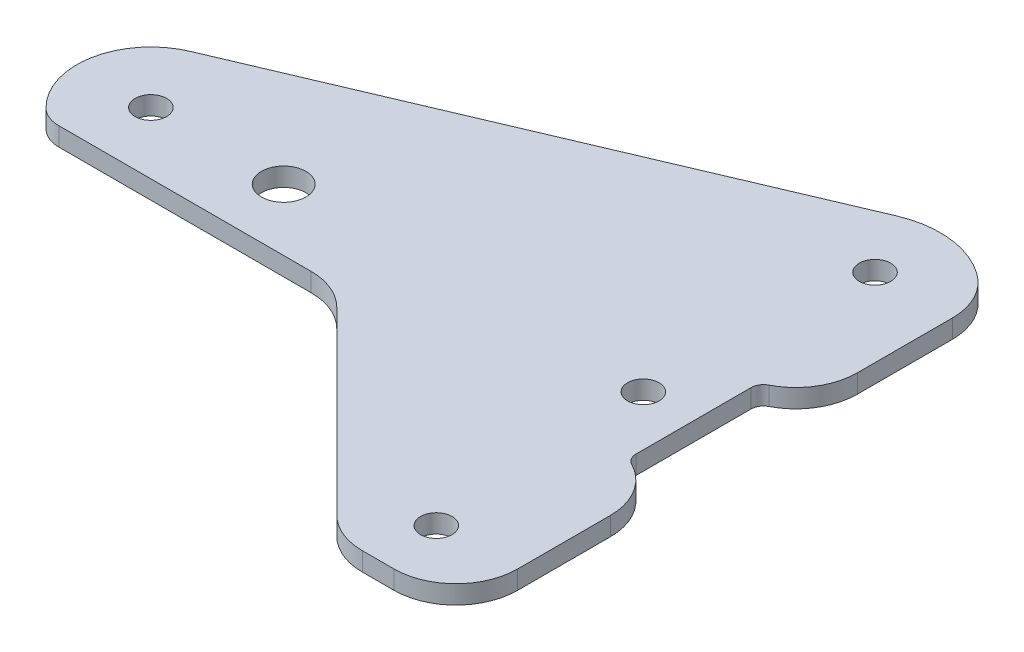
ISO-10303-21;
HEADER;
FILE_DESCRIPTION(('STEP AP214'),'2;1');
FILE_NAME('part.step','',(''),(''),'','','');
FILE_SCHEMA(('AUTOMOTIVE_DESIGN { 1 0 10303 214 1 1 1 1 }'));
ENDSEC;
DATA;
#1=APPLICATION_CONTEXT('core data for automotive mechanical design processes');
#2=APPLICATION_PROTOCOL_DEFINITION('international standard','automotive_design',2000,#1);
#3=PRODUCT_CONTEXT('',#1,'mechanical');
#4=PRODUCT('Part','Part','',(#3));
#5=PRODUCT_RELATED_PRODUCT_CATEGORY('part','',(#4));
#6=PRODUCT_DEFINITION_FORMATION('','',#4);
#7=PRODUCT_DEFINITION_CONTEXT('part definition',#1,'design');
#8=PRODUCT_DEFINITION('design','',#6,#7);
#9=PRODUCT_DEFINITION_SHAPE('','',#8);
#10=(LENGTH_UNIT() NAMED_UNIT(*) SI_UNIT(.MILLI.,.METRE.));
#11=(NAMED_UNIT(*) PLANE_ANGLE_UNIT() SI_UNIT($,.RADIAN.));
#12=(NAMED_UNIT(*) SI_UNIT($,.STERADIAN.) SOLID_ANGLE_UNIT());
#13=UNCERTAINTY_MEASURE_WITH_UNIT(LENGTH_MEASURE(1.E-05),#10,'distance_accuracy_value','');
#14=(GEOMETRIC_REPRESENTATION_CONTEXT(3) GLOBAL_UNCERTAINTY_ASSIGNED_CONTEXT((#13)) GLOBAL_UNIT_ASSIGNED_CONTEXT((#10,
#11,#12)) REPRESENTATION_CONTEXT('',''));
#15=CARTESIAN_POINT('',(0.,0.,0.));
#16=DIRECTION('',(0.,0.,1.));
#17=DIRECTION('',(1.,0.,0.));
#18=AXIS2_PLACEMENT_3D('',#15,#16,#17);
#19=CARTESIAN_POINT('',(164.3506005389,70.6652182043,66.8770558715721));
#20=DIRECTION('',(0.,-1.,0.));
#21=DIRECTION('',(0.,0.,-1.));
#22=AXIS2_PLACEMENT_3D('',#19,#20,#21);
#23=CYLINDRICAL_SURFACE('',#22,9.99999999999454);
#24=CARTESIAN_POINT('',(164.3506005389,67.6652182043,66.8770558715721));
#25=DIRECTION('',(0.,1.,0.));
#26=DIRECTION('',(0.,0.,1.));
#27=AXIS2_PLACEMENT_3D('',#24,#25,#26);
#28=CIRCLE('',#27,9.99999999999454);
#29=CARTESIAN_POINT('',(171.421668350762,67.6652182043,59.8059880597105));
#30=VERTEX_POINT('',#29);
#31=CARTESIAN_POINT('',(164.3506005389,67.6652182043,56.8770558715776));
#32=VERTEX_POINT('',#31);
#33=EDGE_CURVE('E200',#30,#32,#28,.T.);
#34=ORIENTED_EDGE('',*,*,#33,.F.);
#35=DIRECTION('',(0.,-1.,0.));
#36=VECTOR('',#35,1.);
#37=CARTESIAN_POINT('',(171.421668350762,70.6652182043,59.8059880597105));
#38=LINE('',#37,#36);
#39=CARTESIAN_POINT('',(171.421668350762,70.6652182043,59.8059880597105));
#40=VERTEX_POINT('',#39);
#41=EDGE_CURVE('E11',#40,#30,#38,.T.);
#42=ORIENTED_EDGE('',*,*,#41,.F.);
#43=CARTESIAN_POINT('',(164.3506005389,70.6652182043,66.8770558715721));
#44=DIRECTION('',(0.,1.,0.));
#45=DIRECTION('',(0.,0.,1.));
#46=AXIS2_PLACEMENT_3D('',#43,#44,#45);
#47=CIRCLE('',#46,9.99999999999454);
#48=CARTESIAN_POINT('',(164.3506005389,70.6652182043,56.8770558715776));
#49=VERTEX_POINT('',#48);
#50=EDGE_CURVE('E254',#40,#49,#47,.T.);
#51=ORIENTED_EDGE('',*,*,#50,.T.);
#52=DIRECTION('',(0.,-1.,0.));
#53=VECTOR('',#52,1.);
#54=CARTESIAN_POINT('',(164.3506005389,70.6652182043,56.8770558715776));
#55=LINE('',#54,#53);
#56=EDGE_CURVE('E40',#49,#32,#55,.T.);
#57=ORIENTED_EDGE('',*,*,#56,.T.);
#58=EDGE_LOOP('',(#34,#42,#51,#57));
#59=FACE_BOUND('',#58,.T.);
#60=ADVANCED_FACE('F37',(#59),#23,.F.);
#61=CARTESIAN_POINT('',(200.563803974512,70.6652182043,88.9481236834605));
#62=DIRECTION('',(-0.707106781186548,0.,0.707106781186547));
#63=DIRECTION('',(0.707106781186547,0.,0.707106781186548));
#64=AXIS2_PLACEMENT_3D('',#61,#62,#63);
#65=PLANE('',#64);
#66=DIRECTION('',(-0.707106781186547,0.,-0.707106781186548));
#67=VECTOR('',#66,1.);
#68=CARTESIAN_POINT('',(200.563803974512,67.6652182043,88.9481236834605));
#69=LINE('',#68,#67);
#70=CARTESIAN_POINT('',(200.563803974512,67.6652182043,88.9481236834605));
#71=VERTEX_POINT('',#70);
#72=EDGE_CURVE('E252',#71,#30,#69,.T.);
#73=ORIENTED_EDGE('',*,*,#72,.F.);
#74=DIRECTION('',(0.,-1.,0.));
#75=VECTOR('',#74,1.);
#76=CARTESIAN_POINT('',(200.563803974512,70.6652182043,88.9481236834605));
#77=LINE('',#76,#75);
#78=CARTESIAN_POINT('',(200.563803974512,70.6652182043,88.9481236834605));
#79=VERTEX_POINT('',#78);
#80=EDGE_CURVE('E46',#79,#71,#77,.T.);
#81=ORIENTED_EDGE('',*,*,#80,.F.);
#82=DIRECTION('',(-0.707106781186547,0.,-0.707106781186548));
#83=VECTOR('',#82,1.);
#84=CARTESIAN_POINT('',(200.563803974512,70.6652182043,88.9481236834605));
#85=LINE('',#84,#83);
#86=EDGE_CURVE('E190',#79,#40,#85,.T.);
#87=ORIENTED_EDGE('',*,*,#86,.T.);
#88=ORIENTED_EDGE('',*,*,#41,.T.);
#89=EDGE_LOOP('',(#73,#81,#87,#88));
#90=FACE_BOUND('',#89,.T.);
#91=ADVANCED_FACE('F288',(#90),#65,.T.);
#92=CARTESIAN_POINT('',(207.634871786394,70.6652182043,81.8770558715778));
#93=DIRECTION('',(0.,-1.,0.));
#94=DIRECTION('',(0.,0.,-1.));
#95=AXIS2_PLACEMENT_3D('',#92,#93,#94);
#96=CYLINDRICAL_SURFACE('',#95,10.0000000000244);
#97=CARTESIAN_POINT('',(207.634871786394,67.6652182043,81.8770558715778));
#98=DIRECTION('',(0.,-1.,0.));
#99=DIRECTION('',(0.,0.,-1.));
#100=AXIS2_PLACEMENT_3D('',#97,#98,#99);
#101=CIRCLE('',#100,10.0000000000244);
#102=CARTESIAN_POINT('',(207.634871786394,67.6652182043,91.8770558716022));
#103=VERTEX_POINT('',#102);
#104=EDGE_CURVE('E177',#103,#71,#101,.T.);
#105=ORIENTED_EDGE('',*,*,#104,.F.);
#106=DIRECTION('',(0.,-1.,0.));
#107=VECTOR('',#106,1.);
#108=CARTESIAN_POINT('',(207.634871786394,70.6652182043,91.8770558716022));
#109=LINE('',#108,#107);
#110=CARTESIAN_POINT('',(207.634871786394,70.6652182043,91.8770558716022));
#111=VERTEX_POINT('',#110);
#112=EDGE_CURVE('E172',#111,#103,#109,.T.);
#113=ORIENTED_EDGE('',*,*,#112,.F.);
#114=CARTESIAN_POINT('',(207.634871786394,70.6652182043,81.8770558715778));
#115=DIRECTION('',(0.,-1.,0.));
#116=DIRECTION('',(0.,0.,-1.));
#117=AXIS2_PLACEMENT_3D('',#114,#115,#116);
#118=CIRCLE('',#117,10.0000000000244);
#119=EDGE_CURVE('E175',#111,#79,#118,.T.);
#120=ORIENTED_EDGE('',*,*,#119,.T.);
#121=ORIENTED_EDGE('',*,*,#80,.T.);
#122=EDGE_LOOP('',(#105,#113,#120,#121));
#123=FACE_BOUND('',#122,.T.);
#124=ADVANCED_FACE('F174',(#123),#96,.T.);
#125=CARTESIAN_POINT('',(212.764194447496,70.6652182043,91.8770558716022));
#126=DIRECTION('',(0.,0.,1.));
#127=DIRECTION('',(1.,0.,0.));
#128=AXIS2_PLACEMENT_3D('',#125,#126,#127);
#129=PLANE('',#128);
#130=DIRECTION('',(-1.,0.,0.));
#131=VECTOR('',#130,1.);
#132=CARTESIAN_POINT('',(212.764194447496,67.6652182043,91.8770558716022));
#133=LINE('',#132,#131);
#134=CARTESIAN_POINT('',(212.764194447496,67.6652182043,91.8770558716022));
#135=VERTEX_POINT('',#134);
#136=EDGE_CURVE('E249',#135,#103,#133,.T.);
#137=ORIENTED_EDGE('',*,*,#136,.F.);
#138=DIRECTION('',(0.,-1.,0.));
#139=VECTOR('',#138,1.);
#140=CARTESIAN_POINT('',(212.764194447496,70.6652182043,91.8770558716022));
#141=LINE('',#140,#139);
#142=CARTESIAN_POINT('',(212.764194447496,70.6652182043,91.8770558716022));
#143=VERTEX_POINT('',#142);
#144=EDGE_CURVE('E182',#143,#135,#141,.T.);
#145=ORIENTED_EDGE('',*,*,#144,.F.);
#146=DIRECTION('',(-1.,0.,0.));
#147=VECTOR('',#146,1.);
#148=CARTESIAN_POINT('',(212.764194447496,70.6652182043,91.8770558716022));
#149=LINE('',#148,#147);
#150=EDGE_CURVE('E188',#143,#111,#149,.T.);
#151=ORIENTED_EDGE('',*,*,#150,.T.);
#152=ORIENTED_EDGE('',*,*,#112,.T.);
#153=EDGE_LOOP('',(#137,#145,#151,#152));
#154=FACE_BOUND('',#153,.T.);
#155=ADVANCED_FACE('F192',(#154),#129,.T.);
#156=CARTESIAN_POINT('',(212.764194447496,70.6652182043,81.8770558716022));
#157=DIRECTION('',(0.,-1.,0.));
#158=DIRECTION('',(0.,0.,-1.));
#159=AXIS2_PLACEMENT_3D('',#156,#157,#158);
#160=CYLINDRICAL_SURFACE('',#159,9.99999999999999);
#161=CARTESIAN_POINT('',(212.764194447496,67.6652182043,81.8770558716022));
#162=DIRECTION('',(0.,-1.,0.));
#163=DIRECTION('',(0.,0.,-1.));
#164=AXIS2_PLACEMENT_3D('',#161,#162,#163);
#165=CIRCLE('',#164,9.99999999999999);
#166=CARTESIAN_POINT('',(222.764194447496,67.6652182043,81.8770558716022));
#167=VERTEX_POINT('',#166);
#168=EDGE_CURVE('E246',#167,#135,#165,.T.);
#169=ORIENTED_EDGE('',*,*,#168,.F.);
#170=DIRECTION('',(0.,-1.,0.));
#171=VECTOR('',#170,1.);
#172=CARTESIAN_POINT('',(222.764194447496,70.6652182043,81.8770558716022));
#173=LINE('',#172,#171);
#174=CARTESIAN_POINT('',(222.764194447496,70.6652182043,81.8770558716022));
#175=VERTEX_POINT('',#174);
#176=EDGE_CURVE('E258',#175,#167,#173,.T.);
#177=ORIENTED_EDGE('',*,*,#176,.F.);
#178=CARTESIAN_POINT('',(212.764194447496,70.6652182043,81.8770558716022));
#179=DIRECTION('',(0.,-1.,0.));
#180=DIRECTION('',(0.,0.,-1.));
#181=AXIS2_PLACEMENT_3D('',#178,#179,#180);
#182=CIRCLE('',#181,9.99999999999999);
#183=EDGE_CURVE('E193',#175,#143,#182,.T.);
#184=ORIENTED_EDGE('',*,*,#183,.T.);
#185=ORIENTED_EDGE('',*,*,#144,.T.);
#186=EDGE_LOOP('',(#169,#177,#184,#185));
#187=FACE_BOUND('',#186,.T.);
#188=ADVANCED_FACE('F301',(#187),#160,.T.);
#189=CARTESIAN_POINT('',(222.764194447496,70.6652182043,66.8770558715946));
#190=DIRECTION('',(1.,0.,0.));
#191=DIRECTION('',(0.,0.,-1.));
#192=AXIS2_PLACEMENT_3D('',#189,#190,#191);
#193=PLANE('',#192);
#194=DIRECTION('',(0.,0.,1.));
#195=VECTOR('',#194,1.);
#196=CARTESIAN_POINT('',(222.764194447496,67.6652182043,66.8770558715946));
#197=LINE('',#196,#195);
#198=CARTESIAN_POINT('',(222.764194447496,67.6652182043,66.8770558715946));
#199=VERTEX_POINT('',#198);
#200=EDGE_CURVE('E243',#199,#167,#197,.T.);
#201=ORIENTED_EDGE('',*,*,#200,.F.);
#202=DIRECTION('',(0.,-1.,0.));
#203=VECTOR('',#202,1.);
#204=CARTESIAN_POINT('',(222.764194447496,70.6652182043,66.8770558715946));
#205=LINE('',#204,#203);
#206=CARTESIAN_POINT('',(222.764194447496,70.6652182043,66.8770558715946));
#207=VERTEX_POINT('',#206);
#208=EDGE_CURVE('E260',#207,#199,#205,.T.);
#209=ORIENTED_EDGE('',*,*,#208,.F.);
#210=DIRECTION('',(0.,0.,1.));
#211=VECTOR('',#210,1.);
#212=CARTESIAN_POINT('',(222.764194447496,70.6652182043,66.8770558715946));
#213=LINE('',#212,#211);
#214=EDGE_CURVE('E195',#207,#175,#213,.T.);
#215=ORIENTED_EDGE('',*,*,#214,.T.);
#216=ORIENTED_EDGE('',*,*,#176,.T.);
#217=EDGE_LOOP('',(#201,#209,#215,#216));
#218=FACE_BOUND('',#217,.T.);
#219=ADVANCED_FACE('F304',(#218),#193,.T.);
#220=CARTESIAN_POINT('',(212.764194447496,70.6652182043,66.8770558715946));
#221=DIRECTION('',(0.,-1.,0.));
#222=DIRECTION('',(0.,0.,-1.));
#223=AXIS2_PLACEMENT_3D('',#220,#221,#222);
#224=CYLINDRICAL_SURFACE('',#223,10.);
#225=CARTESIAN_POINT('',(212.764194447496,67.6652182043,66.8770558715946));
#226=DIRECTION('',(0.,-1.,0.));
#227=DIRECTION('',(0.,0.,-1.));
#228=AXIS2_PLACEMENT_3D('',#225,#226,#227);
#229=CIRCLE('',#228,10.);
#230=CARTESIAN_POINT('',(217.323870368331,67.6652182043,57.9770920797043));
#231=VERTEX_POINT('',#230);
#232=EDGE_CURVE('E240',#231,#199,#229,.T.);
#233=ORIENTED_EDGE('',*,*,#232,.F.);
#234=DIRECTION('',(0.,-1.,0.));
#235=VECTOR('',#234,1.);
#236=CARTESIAN_POINT('',(217.323870368331,70.6652182043,57.9770920797043));
#237=LINE('',#236,#235);
#238=CARTESIAN_POINT('',(217.323870368331,70.6652182043,57.9770920797043));
#239=VERTEX_POINT('',#238);
#240=EDGE_CURVE('E262',#239,#231,#237,.T.);
#241=ORIENTED_EDGE('',*,*,#240,.F.);
#242=CARTESIAN_POINT('',(212.764194447496,70.6652182043,66.8770558715946));
#243=DIRECTION('',(0.,-1.,0.));
#244=DIRECTION('',(0.,0.,-1.));
#245=AXIS2_PLACEMENT_3D('',#242,#243,#244);
#246=CIRCLE('',#245,10.);
#247=EDGE_CURVE('E457',#239,#207,#246,.T.);
#248=ORIENTED_EDGE('',*,*,#247,.T.);
#249=ORIENTED_EDGE('',*,*,#208,.T.);
#250=EDGE_LOOP('',(#233,#241,#248,#249));
#251=FACE_BOUND('',#250,.T.);
#252=ADVANCED_FACE('F308',(#251),#224,.T.);
#253=CARTESIAN_POINT('',(218.235805552496,70.6652182043,56.19709932133));
#254=DIRECTION('',(0.,-1.,0.));
#255=DIRECTION('',(0.,0.,-1.));
#256=AXIS2_PLACEMENT_3D('',#253,#254,#255);
#257=CYLINDRICAL_SURFACE('',#256,1.99999999999585);
#258=CARTESIAN_POINT('',(218.235805552496,67.6652182043,56.19709932133));
#259=DIRECTION('',(0.,1.,0.));
#260=DIRECTION('',(0.,0.,1.));
#261=AXIS2_PLACEMENT_3D('',#258,#259,#260);
#262=CIRCLE('',#261,1.99999999999585);
#263=CARTESIAN_POINT('',(216.2358055525,67.6652182043,56.19709932133));
#264=VERTEX_POINT('',#263);
#265=EDGE_CURVE('E237',#264,#231,#262,.T.);
#266=ORIENTED_EDGE('',*,*,#265,.F.);
#267=DIRECTION('',(0.,-1.,0.));
#268=VECTOR('',#267,1.);
#269=CARTESIAN_POINT('',(216.2358055525,70.6652182043,56.19709932133));
#270=LINE('',#269,#268);
#271=CARTESIAN_POINT('',(216.2358055525,70.6652182043,56.19709932133));
#272=VERTEX_POINT('',#271);
#273=EDGE_CURVE('E264',#272,#264,#270,.T.);
#274=ORIENTED_EDGE('',*,*,#273,.F.);
#275=CARTESIAN_POINT('',(218.235805552496,70.6652182043,56.19709932133));
#276=DIRECTION('',(0.,1.,0.));
#277=DIRECTION('',(0.,0.,1.));
#278=AXIS2_PLACEMENT_3D('',#275,#276,#277);
#279=CIRCLE('',#278,1.99999999999585);
#280=EDGE_CURVE('E454',#272,#239,#279,.T.);
#281=ORIENTED_EDGE('',*,*,#280,.T.);
#282=ORIENTED_EDGE('',*,*,#240,.T.);
#283=EDGE_LOOP('',(#266,#274,#281,#282));
#284=FACE_BOUND('',#283,.T.);
#285=ADVANCED_FACE('F312',(#284),#257,.F.);
#286=CARTESIAN_POINT('',(216.2358055525,70.6652182043,37.55701242185));
#287=DIRECTION('',(1.,0.,0.));
#288=DIRECTION('',(0.,0.,-1.));
#289=AXIS2_PLACEMENT_3D('',#286,#287,#288);
#290=PLANE('',#289);
#291=DIRECTION('',(0.,0.,1.));
#292=VECTOR('',#291,1.);
#293=CARTESIAN_POINT('',(216.2358055525,67.6652182043,37.55701242185));
#294=LINE('',#293,#292);
#295=CARTESIAN_POINT('',(216.2358055525,67.6652182043,37.55701242185));
#296=VERTEX_POINT('',#295);
#297=EDGE_CURVE('E234',#296,#264,#294,.T.);
#298=ORIENTED_EDGE('',*,*,#297,.F.);
#299=DIRECTION('',(0.,-1.,0.));
#300=VECTOR('',#299,1.);
#301=CARTESIAN_POINT('',(216.2358055525,70.6652182043,37.55701242185));
#302=LINE('',#301,#300);
#303=CARTESIAN_POINT('',(216.2358055525,70.6652182043,37.55701242185));
#304=VERTEX_POINT('',#303);
#305=EDGE_CURVE('E266',#304,#296,#302,.T.);
#306=ORIENTED_EDGE('',*,*,#305,.F.);
#307=DIRECTION('',(0.,0.,1.));
#308=VECTOR('',#307,1.);
#309=CARTESIAN_POINT('',(216.2358055525,70.6652182043,37.55701242185));
#310=LINE('',#309,#308);
#311=EDGE_CURVE('E451',#304,#272,#310,.T.);
#312=ORIENTED_EDGE('',*,*,#311,.T.);
#313=ORIENTED_EDGE('',*,*,#273,.T.);
#314=EDGE_LOOP('',(#298,#306,#312,#313));
#315=FACE_BOUND('',#314,.T.);
#316=ADVANCED_FACE('F316',(#315),#290,.T.);
#317=CARTESIAN_POINT('',(218.2358055525,70.6652182043,37.55701242185));
#318=DIRECTION('',(0.,-1.,0.));
#319=DIRECTION('',(0.,0.,-1.));
#320=AXIS2_PLACEMENT_3D('',#317,#318,#319);
#321=CYLINDRICAL_SURFACE('',#320,1.99999999999944);
#322=CARTESIAN_POINT('',(218.2358055525,67.6652182043,37.55701242185));
#323=DIRECTION('',(0.,1.,0.));
#324=DIRECTION('',(0.,0.,1.));
#325=AXIS2_PLACEMENT_3D('',#322,#323,#324);
#326=CIRCLE('',#325,1.99999999999944);
#327=CARTESIAN_POINT('',(217.323870368332,67.6652182043,35.7770196634733));
#328=VERTEX_POINT('',#327);
#329=EDGE_CURVE('E231',#328,#296,#326,.T.);
#330=ORIENTED_EDGE('',*,*,#329,.F.);
#331=DIRECTION('',(0.,-1.,0.));
#332=VECTOR('',#331,1.);
#333=CARTESIAN_POINT('',(217.323870368332,70.6652182043,35.7770196634733));
#334=LINE('',#333,#332);
#335=CARTESIAN_POINT('',(217.323870368332,70.6652182043,35.7770196634733));
#336=VERTEX_POINT('',#335);
#337=EDGE_CURVE('E268',#336,#328,#334,.T.);
#338=ORIENTED_EDGE('',*,*,#337,.F.);
#339=CARTESIAN_POINT('',(218.2358055525,70.6652182043,37.55701242185));
#340=DIRECTION('',(0.,1.,0.));
#341=DIRECTION('',(0.,0.,1.));
#342=AXIS2_PLACEMENT_3D('',#339,#340,#341);
#343=CIRCLE('',#342,1.99999999999944);
#344=EDGE_CURVE('E448',#336,#304,#343,.T.);
#345=ORIENTED_EDGE('',*,*,#344,.T.);
#346=ORIENTED_EDGE('',*,*,#305,.T.);
#347=EDGE_LOOP('',(#330,#338,#345,#346));
#348=FACE_BOUND('',#347,.T.);
#349=ADVANCED_FACE('F320',(#348),#321,.F.);
#350=CARTESIAN_POINT('',(212.764194447498,70.6652182043,26.8770558715855));
#351=DIRECTION('',(0.,-1.,0.));
#352=DIRECTION('',(0.,0.,-1.));
#353=AXIS2_PLACEMENT_3D('',#350,#351,#352);
#354=CYLINDRICAL_SURFACE('',#353,9.99999999999794);
#355=CARTESIAN_POINT('',(212.764194447498,67.6652182043,26.8770558715855));
#356=DIRECTION('',(0.,-1.,0.));
#357=DIRECTION('',(0.,0.,-1.));
#358=AXIS2_PLACEMENT_3D('',#355,#356,#357);
#359=CIRCLE('',#358,9.99999999999794);
#360=CARTESIAN_POINT('',(222.764194447496,67.6652182043,26.8770558715855));
#361=VERTEX_POINT('',#360);
#362=EDGE_CURVE('E228',#361,#328,#359,.T.);
#363=ORIENTED_EDGE('',*,*,#362,.F.);
#364=DIRECTION('',(0.,-1.,0.));
#365=VECTOR('',#364,1.);
#366=CARTESIAN_POINT('',(222.764194447496,70.6652182043,26.8770558715855));
#367=LINE('',#366,#365);
#368=CARTESIAN_POINT('',(222.764194447496,70.6652182043,26.8770558715855));
#369=VERTEX_POINT('',#368);
#370=EDGE_CURVE('E270',#369,#361,#367,.T.);
#371=ORIENTED_EDGE('',*,*,#370,.F.);
#372=CARTESIAN_POINT('',(212.764194447498,70.6652182043,26.8770558715855));
#373=DIRECTION('',(0.,-1.,0.));
#374=DIRECTION('',(0.,0.,-1.));
#375=AXIS2_PLACEMENT_3D('',#372,#373,#374);
#376=CIRCLE('',#375,9.99999999999794);
#377=EDGE_CURVE('E445',#369,#336,#376,.T.);
#378=ORIENTED_EDGE('',*,*,#377,.T.);
#379=ORIENTED_EDGE('',*,*,#337,.T.);
#380=EDGE_LOOP('',(#363,#371,#378,#379));
#381=FACE_BOUND('',#380,.T.);
#382=ADVANCED_FACE('F324',(#381),#354,.T.);
#383=CARTESIAN_POINT('',(222.764194447496,70.6652182043,11.4982039615155));
#384=DIRECTION('',(1.,0.,0.));
#385=DIRECTION('',(0.,0.,-1.));
#386=AXIS2_PLACEMENT_3D('',#383,#384,#385);
#387=PLANE('',#386);
#388=DIRECTION('',(0.,0.,1.));
#389=VECTOR('',#388,1.);
#390=CARTESIAN_POINT('',(222.764194447496,67.6652182043,11.4982039615155));
#391=LINE('',#390,#389);
#392=CARTESIAN_POINT('',(222.764194447496,67.6652182043,11.4982039615155));
#393=VERTEX_POINT('',#392);
#394=EDGE_CURVE('E225',#393,#361,#391,.T.);
#395=ORIENTED_EDGE('',*,*,#394,.F.);
#396=DIRECTION('',(0.,-1.,0.));
#397=VECTOR('',#396,1.);
#398=CARTESIAN_POINT('',(222.764194447496,70.6652182043,11.4982039615155));
#399=LINE('',#398,#397);
#400=CARTESIAN_POINT('',(222.764194447496,70.6652182043,11.4982039615155));
#401=VERTEX_POINT('',#400);
#402=EDGE_CURVE('E272',#401,#393,#399,.T.);
#403=ORIENTED_EDGE('',*,*,#402,.F.);
#404=DIRECTION('',(0.,0.,1.));
#405=VECTOR('',#404,1.);
#406=CARTESIAN_POINT('',(222.764194447496,70.6652182043,11.4982039615155));
#407=LINE('',#406,#405);
#408=EDGE_CURVE('E442',#401,#369,#407,.T.);
#409=ORIENTED_EDGE('',*,*,#408,.T.);
#410=ORIENTED_EDGE('',*,*,#370,.T.);
#411=EDGE_LOOP('',(#395,#403,#409,#410));
#412=FACE_BOUND('',#411,.T.);
#413=ADVANCED_FACE('F328',(#412),#387,.T.);
#414=CARTESIAN_POINT('',(212.764194447498,70.6652182043,11.4982039615155));
#415=DIRECTION('',(0.,-1.,0.));
#416=DIRECTION('',(0.,0.,-1.));
#417=AXIS2_PLACEMENT_3D('',#414,#415,#416);
#418=CYLINDRICAL_SURFACE('',#417,9.99999999999799);
#419=CARTESIAN_POINT('',(212.764194447498,67.6652182043,11.4982039615155));
#420=DIRECTION('',(0.,-1.,0.));
#421=DIRECTION('',(0.,0.,-1.));
#422=AXIS2_PLACEMENT_3D('',#419,#420,#421);
#423=CIRCLE('',#422,9.99999999999799);
#424=CARTESIAN_POINT('',(218.548253692553,67.6652182043,3.34071300843169));
#425=VERTEX_POINT('',#424);
#426=EDGE_CURVE('E222',#425,#393,#423,.T.);
#427=ORIENTED_EDGE('',*,*,#426,.F.);
#428=DIRECTION('',(0.,-1.,0.));
#429=VECTOR('',#428,1.);
#430=CARTESIAN_POINT('',(218.548253692553,70.6652182043,3.34071300843169));
#431=LINE('',#430,#429);
#432=CARTESIAN_POINT('',(218.548253692553,70.6652182043,3.34071300843169));
#433=VERTEX_POINT('',#432);
#434=EDGE_CURVE('E274',#433,#425,#431,.T.);
#435=ORIENTED_EDGE('',*,*,#434,.F.);
#436=CARTESIAN_POINT('',(212.764194447498,70.6652182043,11.4982039615155));
#437=DIRECTION('',(0.,-1.,0.));
#438=DIRECTION('',(0.,0.,-1.));
#439=AXIS2_PLACEMENT_3D('',#436,#437,#438);
#440=CIRCLE('',#439,9.99999999999799);
#441=EDGE_CURVE('E439',#433,#401,#440,.T.);
#442=ORIENTED_EDGE('',*,*,#441,.T.);
#443=ORIENTED_EDGE('',*,*,#402,.T.);
#444=EDGE_LOOP('',(#427,#435,#442,#443));
#445=FACE_BOUND('',#444,.T.);
#446=ADVANCED_FACE('F332',(#445),#418,.T.);
#447=CARTESIAN_POINT('',(218.489516870081,70.6652182043,3.2990657344106));
#448=DIRECTION('',(0.578405924505795,0.,-0.815749095308476));
#449=DIRECTION('',(-0.815749095308476,0.,-0.578405924505795));
#450=AXIS2_PLACEMENT_3D('',#447,#448,#449);
#451=PLANE('',#450);
#452=DIRECTION('',(0.815749095308476,0.,0.578405924505795));
#453=VECTOR('',#452,1.);
#454=CARTESIAN_POINT('',(218.489516870081,67.6652182043,3.2990657344106));
#455=LINE('',#454,#453);
#456=CARTESIAN_POINT('',(218.489516870081,67.6652182043,3.2990657344106));
#457=VERTEX_POINT('',#456);
#458=EDGE_CURVE('E219',#457,#425,#455,.T.);
#459=ORIENTED_EDGE('',*,*,#458,.F.);
#460=DIRECTION('',(0.,-1.,0.));
#461=VECTOR('',#460,1.);
#462=CARTESIAN_POINT('',(218.489516870081,70.6652182043,3.2990657344106));
#463=LINE('',#462,#461);
#464=CARTESIAN_POINT('',(218.489516870081,70.6652182043,3.2990657344106));
#465=VERTEX_POINT('',#464);
#466=EDGE_CURVE('E276',#465,#457,#463,.T.);
#467=ORIENTED_EDGE('',*,*,#466,.F.);
#468=DIRECTION('',(0.815749095308476,0.,0.578405924505795));
#469=VECTOR('',#468,1.);
#470=CARTESIAN_POINT('',(218.489516870081,70.6652182043,3.2990657344106));
#471=LINE('',#470,#469);
#472=EDGE_CURVE('E436',#465,#433,#471,.T.);
#473=ORIENTED_EDGE('',*,*,#472,.T.);
#474=ORIENTED_EDGE('',*,*,#434,.T.);
#475=EDGE_LOOP('',(#459,#467,#473,#474));
#476=FACE_BOUND('',#475,.T.);
#477=ADVANCED_FACE('F336',(#476),#451,.T.);
#478=CARTESIAN_POINT('',(209.813428002494,70.6652182043,15.5353021640408));
#479=DIRECTION('',(0.,-1.,0.));
#480=DIRECTION('',(0.,0.,-1.));
#481=AXIS2_PLACEMENT_3D('',#478,#479,#480);
#482=CYLINDRICAL_SURFACE('',#481,15.0000000000026);
#483=CARTESIAN_POINT('',(209.813428002494,67.6652182043,15.5353021640408));
#484=DIRECTION('',(0.,-1.,0.));
#485=DIRECTION('',(0.,0.,-1.));
#486=AXIS2_PLACEMENT_3D('',#483,#484,#485);
#487=CIRCLE('',#486,15.0000000000026);
#488=CARTESIAN_POINT('',(203.945738541146,67.6652182043,1.73058484041302));
#489=VERTEX_POINT('',#488);
#490=EDGE_CURVE('E216',#489,#457,#487,.T.);
#491=ORIENTED_EDGE('',*,*,#490,.F.);
#492=DIRECTION('',(0.,-1.,0.));
#493=VECTOR('',#492,1.);
#494=CARTESIAN_POINT('',(203.945738541146,70.6652182043,1.73058484041302));
#495=LINE('',#494,#493);
#496=CARTESIAN_POINT('',(203.945738541146,70.6652182043,1.73058484041302));
#497=VERTEX_POINT('',#496);
#498=EDGE_CURVE('E278',#497,#489,#495,.T.);
#499=ORIENTED_EDGE('',*,*,#498,.F.);
#500=CARTESIAN_POINT('',(209.813428002494,70.6652182043,15.5353021640408));
#501=DIRECTION('',(0.,-1.,0.));
#502=DIRECTION('',(0.,0.,-1.));
#503=AXIS2_PLACEMENT_3D('',#500,#501,#502);
#504=CIRCLE('',#503,15.0000000000026);
#505=EDGE_CURVE('E433',#497,#465,#504,.T.);
#506=ORIENTED_EDGE('',*,*,#505,.T.);
#507=ORIENTED_EDGE('',*,*,#466,.T.);
#508=EDGE_LOOP('',(#491,#499,#506,#507));
#509=FACE_BOUND('',#508,.T.);
#510=ADVANCED_FACE('F340',(#509),#482,.T.);
#511=CARTESIAN_POINT('',(123.713460139616,70.6652182043,35.8332820126896));
#512=DIRECTION('',(-0.3911792974231,0.,-0.920314488241693));
#513=DIRECTION('',(-0.920314488241693,0.,0.3911792974231));
#514=AXIS2_PLACEMENT_3D('',#511,#512,#513);
#515=PLANE('',#514);
#516=DIRECTION('',(0.920314488241693,0.,-0.3911792974231));
#517=VECTOR('',#516,1.);
#518=CARTESIAN_POINT('',(123.713460139616,67.6652182043,35.8332820126896));
#519=LINE('',#518,#517);
#520=CARTESIAN_POINT('',(123.713460139616,67.6652182043,35.8332820126896));
#521=VERTEX_POINT('',#520);
#522=EDGE_CURVE('E213',#521,#489,#519,.T.);
#523=ORIENTED_EDGE('',*,*,#522,.F.);
#524=DIRECTION('',(0.,-1.,0.));
#525=VECTOR('',#524,1.);
#526=CARTESIAN_POINT('',(123.713460139616,70.6652182043,35.8332820126896));
#527=LINE('',#526,#525);
#528=CARTESIAN_POINT('',(123.713460139616,70.6652182043,35.8332820126896));
#529=VERTEX_POINT('',#528);
#530=EDGE_CURVE('E280',#529,#521,#527,.T.);
#531=ORIENTED_EDGE('',*,*,#530,.F.);
#532=DIRECTION('',(0.920314488241693,0.,-0.3911792974231));
#533=VECTOR('',#532,1.);
#534=CARTESIAN_POINT('',(123.713460139616,70.6652182043,35.8332820126896));
#535=LINE('',#534,#533);
#536=EDGE_CURVE('E430',#529,#497,#535,.T.);
#537=ORIENTED_EDGE('',*,*,#536,.T.);
#538=ORIENTED_EDGE('',*,*,#498,.T.);
#539=EDGE_LOOP('',(#523,#531,#537,#538));
#540=FACE_BOUND('',#539,.T.);
#541=ADVANCED_FACE('F344',(#540),#515,.T.);
#542=CARTESIAN_POINT('',(128.407611708695,70.6652182043,46.8770558715943));
#543=DIRECTION('',(0.,-1.,0.));
#544=DIRECTION('',(0.,0.,-1.));
#545=AXIS2_PLACEMENT_3D('',#542,#543,#544);
#546=CYLINDRICAL_SURFACE('',#545,12.0000000000048);
#547=CARTESIAN_POINT('',(128.407611708695,67.6652182043,46.8770558715943));
#548=DIRECTION('',(0.,-1.,0.));
#549=DIRECTION('',(0.,0.,-1.));
#550=AXIS2_PLACEMENT_3D('',#547,#548,#549);
#551=CIRCLE('',#550,12.0000000000048);
#552=CARTESIAN_POINT('',(120.009361161977,67.6652182043,55.4484844429975));
#553=VERTEX_POINT('',#552);
#554=EDGE_CURVE('E210',#553,#521,#551,.T.);
#555=ORIENTED_EDGE('',*,*,#554,.F.);
#556=DIRECTION('',(0.,-1.,0.));
#557=VECTOR('',#556,1.);
#558=CARTESIAN_POINT('',(120.009361161977,70.6652182043,55.4484844429975));
#559=LINE('',#558,#557);
#560=CARTESIAN_POINT('',(120.009361161977,70.6652182043,55.4484844429975));
#561=VERTEX_POINT('',#560);
#562=EDGE_CURVE('E282',#561,#553,#559,.T.);
#563=ORIENTED_EDGE('',*,*,#562,.F.);
#564=CARTESIAN_POINT('',(128.407611708695,70.6652182043,46.8770558715943));
#565=DIRECTION('',(0.,-1.,0.));
#566=DIRECTION('',(0.,0.,-1.));
#567=AXIS2_PLACEMENT_3D('',#564,#565,#566);
#568=CIRCLE('',#567,12.0000000000048);
#569=EDGE_CURVE('E427',#561,#529,#568,.T.);
#570=ORIENTED_EDGE('',*,*,#569,.T.);
#571=ORIENTED_EDGE('',*,*,#530,.T.);
#572=EDGE_LOOP('',(#555,#563,#570,#571));
#573=FACE_BOUND('',#572,.T.);
#574=ADVANCED_FACE('F348',(#573),#546,.T.);
#575=CARTESIAN_POINT('',(123.5086322231,70.6652182043,51.87705587159));
#576=DIRECTION('',(0.,-1.,0.));
#577=DIRECTION('',(0.,0.,-1.));
#578=AXIS2_PLACEMENT_3D('',#575,#576,#577);
#579=CYLINDRICAL_SURFACE('',#578,4.99999999998758);
#580=CARTESIAN_POINT('',(123.5086322231,67.6652182043,51.87705587159));
#581=DIRECTION('',(0.,-1.,0.));
#582=DIRECTION('',(0.,0.,-1.));
#583=AXIS2_PLACEMENT_3D('',#580,#581,#582);
#584=CIRCLE('',#583,4.99999999998758);
#585=CARTESIAN_POINT('',(123.5086322231,67.6652182043,56.8770558715776));
#586=VERTEX_POINT('',#585);
#587=EDGE_CURVE('E207',#586,#553,#584,.T.);
#588=ORIENTED_EDGE('',*,*,#587,.F.);
#589=DIRECTION('',(0.,-1.,0.));
#590=VECTOR('',#589,1.);
#591=CARTESIAN_POINT('',(123.5086322231,70.6652182043,56.8770558715776));
#592=LINE('',#591,#590);
#593=CARTESIAN_POINT('',(123.5086322231,70.6652182043,56.8770558715776));
#594=VERTEX_POINT('',#593);
#595=EDGE_CURVE('E283',#594,#586,#592,.T.);
#596=ORIENTED_EDGE('',*,*,#595,.F.);
#597=CARTESIAN_POINT('',(123.5086322231,70.6652182043,51.87705587159));
#598=DIRECTION('',(0.,-1.,0.));
#599=DIRECTION('',(0.,0.,-1.));
#600=AXIS2_PLACEMENT_3D('',#597,#598,#599);
#601=CIRCLE('',#600,4.99999999998758);
#602=EDGE_CURVE('E424',#594,#561,#601,.T.);
#603=ORIENTED_EDGE('',*,*,#602,.T.);
#604=ORIENTED_EDGE('',*,*,#562,.T.);
#605=EDGE_LOOP('',(#588,#596,#603,#604));
#606=FACE_BOUND('',#605,.T.);
#607=ADVANCED_FACE('F352',(#606),#579,.T.);
#608=CARTESIAN_POINT('',(164.3506005389,70.6652182043,56.8770558715776));
#609=DIRECTION('',(0.,0.,1.));
#610=DIRECTION('',(1.,0.,0.));
#611=AXIS2_PLACEMENT_3D('',#608,#609,#610);
#612=PLANE('',#611);
#613=DIRECTION('',(-1.,0.,0.));
#614=VECTOR('',#613,1.);
#615=CARTESIAN_POINT('',(164.3506005389,67.6652182043,56.8770558715776));
#616=LINE('',#615,#614);
#617=EDGE_CURVE('E203',#32,#586,#616,.T.);
#618=ORIENTED_EDGE('',*,*,#617,.F.);
#619=ORIENTED_EDGE('',*,*,#56,.F.);
#620=DIRECTION('',(-1.,0.,0.));
#621=VECTOR('',#620,1.);
#622=CARTESIAN_POINT('',(164.3506005389,70.6652182043,56.8770558715776));
#623=LINE('',#622,#621);
#624=EDGE_CURVE('E422',#49,#594,#623,.T.);
#625=ORIENTED_EDGE('',*,*,#624,.T.);
#626=ORIENTED_EDGE('',*,*,#595,.T.);
#627=EDGE_LOOP('',(#618,#619,#625,#626));
#628=FACE_BOUND('',#627,.T.);
#629=ADVANCED_FACE('F285',(#628),#612,.T.);
#630=CARTESIAN_POINT('',(164.3506005389,70.6652182043,66.8770558715721));
#631=DIRECTION('',(0.,1.,0.));
#632=DIRECTION('',(0.,0.,1.));
#633=AXIS2_PLACEMENT_3D('',#630,#631,#632);
#634=PLANE('',#633);
#635=CARTESIAN_POINT('',(208.1076117087,70.6652182043,46.87705587159));
#636=DIRECTION('',(0.,1.,0.));
#637=DIRECTION('',(0.,0.,1.));
#638=AXIS2_PLACEMENT_3D('',#635,#636,#637);
#639=CIRCLE('',#638,2.54999999999999);
#640=CARTESIAN_POINT('',(208.1076117087,70.6652182043,49.42705587159));
#641=VERTEX_POINT('',#640);
#642=EDGE_CURVE('E394',#641,#641,#639,.T.);
#643=ORIENTED_EDGE('',*,*,#642,.F.);
#644=EDGE_LOOP('',(#643));
#645=FACE_BOUND('',#644,.T.);
#646=CARTESIAN_POINT('',(128.407611708695,70.6652182043,46.8770558715943));
#647=DIRECTION('',(0.,-1.,0.));
#648=DIRECTION('',(0.,0.,1.));
#649=AXIS2_PLACEMENT_3D('',#646,#647,#648);
#650=CIRCLE('',#649,2.54999999999568);
#651=CARTESIAN_POINT('',(128.407611708695,70.6652182043,49.42705587159));
#652=VERTEX_POINT('',#651);
#653=EDGE_CURVE('E399',#652,#652,#650,.T.);
#654=ORIENTED_EDGE('',*,*,#653,.T.);
#655=EDGE_LOOP('',(#654));
#656=FACE_BOUND('',#655,.T.);
#657=CARTESIAN_POINT('',(149.9,70.6652182043,46.87705587159));
#658=DIRECTION('',(0.,-1.,0.));
#659=DIRECTION('',(0.,0.,1.));
#660=AXIS2_PLACEMENT_3D('',#657,#658,#659);
#661=CIRCLE('',#660,3.59999999999999);
#662=CARTESIAN_POINT('',(149.9,70.6652182043,50.47705587159));
#663=VERTEX_POINT('',#662);
#664=EDGE_CURVE('E405',#663,#663,#661,.T.);
#665=ORIENTED_EDGE('',*,*,#664,.T.);
#666=EDGE_LOOP('',(#665));
#667=FACE_BOUND('',#666,.T.);
#668=CARTESIAN_POINT('',(210.1,70.6652182043,11.37705587159));
#669=DIRECTION('',(0.,-1.,0.));
#670=DIRECTION('',(0.,0.,1.));
#671=AXIS2_PLACEMENT_3D('',#668,#669,#670);
#672=CIRCLE('',#671,2.55);
#673=CARTESIAN_POINT('',(210.1,70.6652182043,13.92705587159));
#674=VERTEX_POINT('',#673);
#675=EDGE_CURVE('E411',#674,#674,#672,.T.);
#676=ORIENTED_EDGE('',*,*,#675,.T.);
#677=EDGE_LOOP('',(#676));
#678=FACE_BOUND('',#677,.T.);
#679=CARTESIAN_POINT('',(210.1,70.6652182043,82.37705587159));
#680=DIRECTION('',(0.,-1.,0.));
#681=DIRECTION('',(0.,0.,1.));
#682=AXIS2_PLACEMENT_3D('',#679,#680,#681);
#683=CIRCLE('',#682,2.55);
#684=CARTESIAN_POINT('',(210.1,70.6652182043,84.92705587159));
#685=VERTEX_POINT('',#684);
#686=EDGE_CURVE('E204',#685,#685,#683,.T.);
#687=ORIENTED_EDGE('',*,*,#686,.T.);
#688=EDGE_LOOP('',(#687));
#689=FACE_BOUND('',#688,.T.);
#690=ORIENTED_EDGE('',*,*,#50,.F.);
#691=ORIENTED_EDGE('',*,*,#86,.F.);
#692=ORIENTED_EDGE('',*,*,#119,.F.);
#693=ORIENTED_EDGE('',*,*,#150,.F.);
#694=ORIENTED_EDGE('',*,*,#183,.F.);
#695=ORIENTED_EDGE('',*,*,#214,.F.);
#696=ORIENTED_EDGE('',*,*,#247,.F.);
#697=ORIENTED_EDGE('',*,*,#280,.F.);
#698=ORIENTED_EDGE('',*,*,#311,.F.);
#699=ORIENTED_EDGE('',*,*,#344,.F.);
#700=ORIENTED_EDGE('',*,*,#377,.F.);
#701=ORIENTED_EDGE('',*,*,#408,.F.);
#702=ORIENTED_EDGE('',*,*,#441,.F.);
#703=ORIENTED_EDGE('',*,*,#472,.F.);
#704=ORIENTED_EDGE('',*,*,#505,.F.);
#705=ORIENTED_EDGE('',*,*,#536,.F.);
#706=ORIENTED_EDGE('',*,*,#569,.F.);
#707=ORIENTED_EDGE('',*,*,#602,.F.);
#708=ORIENTED_EDGE('',*,*,#624,.F.);
#709=EDGE_LOOP('',(#690,#691,#692,#693,#694,#695,#696,#697,#698,#699,#700,#701,#702,#703,#704,
#705,#706,#707,#708));
#710=FACE_BOUND('',#709,.T.);
#711=ADVANCED_FACE('F186',(#645,#656,#667,#678,#689,#710),#634,.T.);
#712=CARTESIAN_POINT('',(164.3506005389,67.6652182043,66.8770558715721));
#713=DIRECTION('',(0.,1.,0.));
#714=DIRECTION('',(0.,0.,1.));
#715=AXIS2_PLACEMENT_3D('',#712,#713,#714);
#716=PLANE('',#715);
#717=CARTESIAN_POINT('',(208.1076117087,67.6652182043,46.87705587159));
#718=DIRECTION('',(0.,1.,0.));
#719=DIRECTION('',(0.,0.,1.));
#720=AXIS2_PLACEMENT_3D('',#717,#718,#719);
#721=CIRCLE('',#720,2.54999999999999);
#722=CARTESIAN_POINT('',(208.1076117087,67.6652182043,49.42705587159));
#723=VERTEX_POINT('',#722);
#724=EDGE_CURVE('E392',#723,#723,#721,.T.);
#725=ORIENTED_EDGE('',*,*,#724,.T.);
#726=EDGE_LOOP('',(#725));
#727=FACE_BOUND('',#726,.T.);
#728=CARTESIAN_POINT('',(128.407611708695,67.6652182043,46.8770558715943));
#729=DIRECTION('',(0.,-1.,0.));
#730=DIRECTION('',(0.,0.,1.));
#731=AXIS2_PLACEMENT_3D('',#728,#729,#730);
#732=CIRCLE('',#731,2.54999999999568);
#733=CARTESIAN_POINT('',(128.407611708695,67.6652182043,49.42705587159));
#734=VERTEX_POINT('',#733);
#735=EDGE_CURVE('E396',#734,#734,#732,.T.);
#736=ORIENTED_EDGE('',*,*,#735,.F.);
#737=EDGE_LOOP('',(#736));
#738=FACE_BOUND('',#737,.T.);
#739=CARTESIAN_POINT('',(149.9,67.6652182043,46.87705587159));
#740=DIRECTION('',(0.,-1.,0.));
#741=DIRECTION('',(0.,0.,1.));
#742=AXIS2_PLACEMENT_3D('',#739,#740,#741);
#743=CIRCLE('',#742,3.59999999999999);
#744=CARTESIAN_POINT('',(149.9,67.6652182043,50.47705587159));
#745=VERTEX_POINT('',#744);
#746=EDGE_CURVE('E402',#745,#745,#743,.T.);
#747=ORIENTED_EDGE('',*,*,#746,.F.);
#748=EDGE_LOOP('',(#747));
#749=FACE_BOUND('',#748,.T.);
#750=CARTESIAN_POINT('',(210.1,67.6652182043,11.37705587159));
#751=DIRECTION('',(0.,-1.,0.));
#752=DIRECTION('',(0.,0.,1.));
#753=AXIS2_PLACEMENT_3D('',#750,#751,#752);
#754=CIRCLE('',#753,2.55);
#755=CARTESIAN_POINT('',(210.1,67.6652182043,13.92705587159));
#756=VERTEX_POINT('',#755);
#757=EDGE_CURVE('E408',#756,#756,#754,.T.);
#758=ORIENTED_EDGE('',*,*,#757,.F.);
#759=EDGE_LOOP('',(#758));
#760=FACE_BOUND('',#759,.T.);
#761=CARTESIAN_POINT('',(210.1,67.6652182043,82.37705587159));
#762=DIRECTION('',(0.,-1.,0.));
#763=DIRECTION('',(0.,0.,1.));
#764=AXIS2_PLACEMENT_3D('',#761,#762,#763);
#765=CIRCLE('',#764,2.55);
#766=CARTESIAN_POINT('',(210.1,67.6652182043,84.92705587159));
#767=VERTEX_POINT('',#766);
#768=EDGE_CURVE('E414',#767,#767,#765,.T.);
#769=ORIENTED_EDGE('',*,*,#768,.F.);
#770=EDGE_LOOP('',(#769));
#771=FACE_BOUND('',#770,.T.);
#772=ORIENTED_EDGE('',*,*,#33,.T.);
#773=ORIENTED_EDGE('',*,*,#617,.T.);
#774=ORIENTED_EDGE('',*,*,#587,.T.);
#775=ORIENTED_EDGE('',*,*,#554,.T.);
#776=ORIENTED_EDGE('',*,*,#522,.T.);
#777=ORIENTED_EDGE('',*,*,#490,.T.);
#778=ORIENTED_EDGE('',*,*,#458,.T.);
#779=ORIENTED_EDGE('',*,*,#426,.T.);
#780=ORIENTED_EDGE('',*,*,#394,.T.);
#781=ORIENTED_EDGE('',*,*,#362,.T.);
#782=ORIENTED_EDGE('',*,*,#329,.T.);
#783=ORIENTED_EDGE('',*,*,#297,.T.);
#784=ORIENTED_EDGE('',*,*,#265,.T.);
#785=ORIENTED_EDGE('',*,*,#232,.T.);
#786=ORIENTED_EDGE('',*,*,#200,.T.);
#787=ORIENTED_EDGE('',*,*,#168,.T.);
#788=ORIENTED_EDGE('',*,*,#136,.T.);
#789=ORIENTED_EDGE('',*,*,#104,.T.);
#790=ORIENTED_EDGE('',*,*,#72,.T.);
#791=EDGE_LOOP('',(#772,#773,#774,#775,#776,#777,#778,#779,#780,#781,#782,#783,#784,#785,#786,
#787,#788,#789,#790));
#792=FACE_BOUND('',#791,.T.);
#793=ADVANCED_FACE('F287',(#727,#738,#749,#760,#771,#792),#716,.F.);
#794=CARTESIAN_POINT('',(210.1,70.6652182043,82.37705587159));
#795=DIRECTION('',(0.,-1.,0.));
#796=DIRECTION('',(0.,0.,-1.));
#797=AXIS2_PLACEMENT_3D('',#794,#795,#796);
#798=CYLINDRICAL_SURFACE('',#797,2.55);
#799=ORIENTED_EDGE('',*,*,#686,.F.);
#800=EDGE_LOOP('',(#799));
#801=FACE_BOUND('',#800,.T.);
#802=ORIENTED_EDGE('',*,*,#768,.T.);
#803=EDGE_LOOP('',(#802));
#804=FACE_BOUND('',#803,.T.);
#805=ADVANCED_FACE('F364',(#801,#804),#798,.F.);
#806=CARTESIAN_POINT('',(210.1,70.6652182043,11.37705587159));
#807=DIRECTION('',(0.,-1.,0.));
#808=DIRECTION('',(0.,0.,-1.));
#809=AXIS2_PLACEMENT_3D('',#806,#807,#808);
#810=CYLINDRICAL_SURFACE('',#809,2.55);
#811=ORIENTED_EDGE('',*,*,#675,.F.);
#812=EDGE_LOOP('',(#811));
#813=FACE_BOUND('',#812,.T.);
#814=ORIENTED_EDGE('',*,*,#757,.T.);
#815=EDGE_LOOP('',(#814));
#816=FACE_BOUND('',#815,.T.);
#817=ADVANCED_FACE('F371',(#813,#816),#810,.F.);
#818=CARTESIAN_POINT('',(149.9,70.6652182043,46.87705587159));
#819=DIRECTION('',(0.,-1.,0.));
#820=DIRECTION('',(0.,0.,-1.));
#821=AXIS2_PLACEMENT_3D('',#818,#819,#820);
#822=CYLINDRICAL_SURFACE('',#821,3.59999999999999);
#823=ORIENTED_EDGE('',*,*,#664,.F.);
#824=EDGE_LOOP('',(#823));
#825=FACE_BOUND('',#824,.T.);
#826=ORIENTED_EDGE('',*,*,#746,.T.);
#827=EDGE_LOOP('',(#826));
#828=FACE_BOUND('',#827,.T.);
#829=ADVANCED_FACE('F375',(#825,#828),#822,.F.);
#830=CARTESIAN_POINT('',(128.407611708695,70.6652182043,46.8770558715943));
#831=DIRECTION('',(0.,-1.,0.));
#832=DIRECTION('',(0.,0.,-1.));
#833=AXIS2_PLACEMENT_3D('',#830,#831,#832);
#834=CYLINDRICAL_SURFACE('',#833,2.54999999999568);
#835=ORIENTED_EDGE('',*,*,#653,.F.);
#836=EDGE_LOOP('',(#835));
#837=FACE_BOUND('',#836,.T.);
#838=ORIENTED_EDGE('',*,*,#735,.T.);
#839=EDGE_LOOP('',(#838));
#840=FACE_BOUND('',#839,.T.);
#841=ADVANCED_FACE('F379',(#837,#840),#834,.F.);
#842=CARTESIAN_POINT('',(208.1076117087,67.6652182043,46.87705587159));
#843=DIRECTION('',(0.,1.,0.));
#844=DIRECTION('',(0.,0.,1.));
#845=AXIS2_PLACEMENT_3D('',#842,#843,#844);
#846=CYLINDRICAL_SURFACE('',#845,2.54999999999999);
#847=ORIENTED_EDGE('',*,*,#724,.F.);
#848=EDGE_LOOP('',(#847));
#849=FACE_BOUND('',#848,.T.);
#850=ORIENTED_EDGE('',*,*,#642,.T.);
#851=EDGE_LOOP('',(#850));
#852=FACE_BOUND('',#851,.T.);
#853=ADVANCED_FACE('F383',(#849,#852),#846,.F.);
#854=CLOSED_SHELL('',(#60,#91,#124,#155,#188,#219,#252,#285,#316,#349,#382,#413,#446,#477,#510,
#541,#574,#607,#629,#711,#793,#805,#817,#829,#841,#853));
#855=MANIFOLD_SOLID_BREP('B2',#854);
#856=ADVANCED_BREP_SHAPE_REPRESENTATION('',(#18,#855),#14);
#857=SHAPE_DEFINITION_REPRESENTATION(#9,#856);
ENDSEC;
END-ISO-10303-21;
